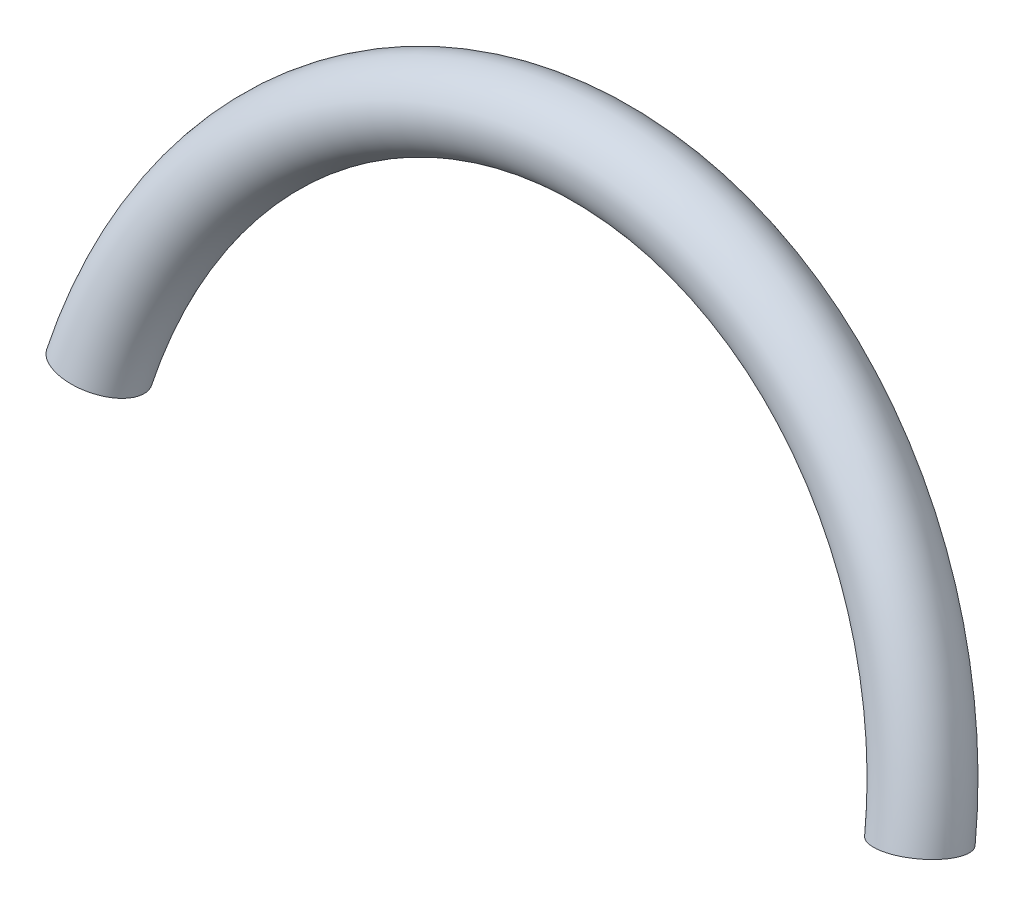
ISO-10303-21;
HEADER;
FILE_DESCRIPTION(('STEP AP214'),'2;1');
FILE_NAME('part.step','',(''),(''),'','','');
FILE_SCHEMA(('AUTOMOTIVE_DESIGN { 1 0 10303 214 1 1 1 1 }'));
ENDSEC;
DATA;
#1=APPLICATION_CONTEXT('core data for automotive mechanical design processes');
#2=APPLICATION_PROTOCOL_DEFINITION('international standard','automotive_design',2000,#1);
#3=PRODUCT_CONTEXT('',#1,'mechanical');
#4=PRODUCT('Part','Part','',(#3));
#5=PRODUCT_RELATED_PRODUCT_CATEGORY('part','',(#4));
#6=PRODUCT_DEFINITION_FORMATION('','',#4);
#7=PRODUCT_DEFINITION_CONTEXT('part definition',#1,'design');
#8=PRODUCT_DEFINITION('design','',#6,#7);
#9=PRODUCT_DEFINITION_SHAPE('','',#8);
#10=(LENGTH_UNIT() NAMED_UNIT(*) SI_UNIT(.MILLI.,.METRE.));
#11=(NAMED_UNIT(*) PLANE_ANGLE_UNIT() SI_UNIT($,.RADIAN.));
#12=(NAMED_UNIT(*) SI_UNIT($,.STERADIAN.) SOLID_ANGLE_UNIT());
#13=UNCERTAINTY_MEASURE_WITH_UNIT(LENGTH_MEASURE(1.E-05),#10,'distance_accuracy_value','');
#14=(GEOMETRIC_REPRESENTATION_CONTEXT(3) GLOBAL_UNCERTAINTY_ASSIGNED_CONTEXT((#13)) GLOBAL_UNIT_ASSIGNED_CONTEXT((#10,
#11,#12)) REPRESENTATION_CONTEXT('',''));
#15=CARTESIAN_POINT('',(0.,0.,0.));
#16=DIRECTION('',(0.,0.,1.));
#17=DIRECTION('',(1.,0.,0.));
#18=AXIS2_PLACEMENT_3D('',#15,#16,#17);
#19=CARTESIAN_POINT('',(0.,904.255410655569,-1942.29450703663));
#20=DIRECTION('',(0.,-0.258819045102518,-0.965925826289069));
#21=DIRECTION('',(0.,0.965925826289069,-0.258819045102518));
#22=AXIS2_PLACEMENT_3D('',#19,#20,#21);
#23=TOROIDAL_SURFACE('',#22,116.149429379517,9.79999999999998);
#24=CARTESIAN_POINT('',(-115.,920.,-1946.51325703663));
#25=DIRECTION('',(-0.140336447675245,-0.956366902675757,0.25625773923976));
#26=DIRECTION('',(0.,-0.258819045102461,-0.965925826289084));
#27=AXIS2_PLACEMENT_3D('',#24,#25,#26);
#28=CIRCLE('',#27,9.79999999999998);
#29=CARTESIAN_POINT('',(-124.703017965913,921.328435071956,-1946.86921014136));
#30=VERTEX_POINT('',#29);
#31=EDGE_CURVE('E49',#30,#30,#28,.T.);
#32=CARTESIAN_POINT('',(115.,920.,-1946.51325703663));
#33=DIRECTION('',(0.140336447675245,-0.956366902675727,0.256257739239872));
#34=DIRECTION('',(0.,-0.258819045102574,-0.965925826289054));
#35=AXIS2_PLACEMENT_3D('',#32,#33,#34);
#36=CIRCLE('',#35,9.79999999999998);
#37=CARTESIAN_POINT('',(124.703017965913,921.328435071956,-1946.86921014136));
#38=VERTEX_POINT('',#37);
#39=EDGE_CURVE('E10',#38,#38,#36,.T.);
#40=CARTESIAN_POINT('',(0.,904.255410655569,-1942.29450703663));
#41=DIRECTION('',(0.,-0.258819045102518,-0.965925826289069));
#42=DIRECTION('',(0.,0.965925826289069,-0.258819045102518));
#43=AXIS2_PLACEMENT_3D('',#40,#41,#42);
#44=CIRCLE('',#43,125.949429379517);
#45=EDGE_CURVE('',#30,#38,#44,.T.);
#46=ORIENTED_EDGE('',*,*,#31,.T.);
#47=ORIENTED_EDGE('',*,*,#39,.T.);
#48=ORIENTED_EDGE('',*,*,#45,.T.);
#49=ORIENTED_EDGE('',*,*,#45,.F.);
#50=EDGE_LOOP('',(#46,#48,#47,#49));
#51=FACE_BOUND('',#50,.T.);
#52=ADVANCED_FACE('F39',(#51),#23,.F.);
#53=CARTESIAN_POINT('',(115.,920.,-1946.51325703663));
#54=DIRECTION('',(0.140336447675245,-0.956366902675727,0.256257739239872));
#55=DIRECTION('',(0.,-0.258819045102574,-0.965925826289054));
#56=AXIS2_PLACEMENT_3D('',#53,#54,#55);
#57=PLANE('',#56);
#58=ORIENTED_EDGE('',*,*,#39,.F.);
#59=EDGE_LOOP('',(#58));
#60=FACE_BOUND('',#59,.T.);
#61=CARTESIAN_POINT('',(115.,920.,-1946.51325703663));
#62=DIRECTION('',(0.140336447675245,-0.956366902675727,0.256257739239872));
#63=DIRECTION('',(0.,-0.258819045102574,-0.965925826289054));
#64=AXIS2_PLACEMENT_3D('',#61,#62,#63);
#65=CIRCLE('',#64,11.);
#66=CARTESIAN_POINT('',(125.891142614801,921.491100590971,-1946.91279623581));
#67=VERTEX_POINT('',#66);
#68=EDGE_CURVE('E45',#67,#67,#65,.F.);
#69=ORIENTED_EDGE('',*,*,#68,.F.);
#70=EDGE_LOOP('',(#69));
#71=FACE_BOUND('',#70,.T.);
#72=ADVANCED_FACE('F69',(#60,#71),#57,.T.);
#73=CARTESIAN_POINT('',(0.,904.255410655569,-1942.29450703663));
#74=DIRECTION('',(0.,-0.258819045102518,-0.965925826289069));
#75=DIRECTION('',(0.,0.965925826289069,-0.258819045102518));
#76=AXIS2_PLACEMENT_3D('',#73,#74,#75);
#77=TOROIDAL_SURFACE('',#76,116.149429379517,11.);
#78=CARTESIAN_POINT('',(-115.,920.,-1946.51325703663));
#79=DIRECTION('',(-0.140336447675245,-0.956366902675757,0.25625773923976));
#80=DIRECTION('',(0.,-0.258819045102461,-0.965925826289084));
#81=AXIS2_PLACEMENT_3D('',#78,#79,#80);
#82=CIRCLE('',#81,11.);
#83=CARTESIAN_POINT('',(-125.891142614801,921.491100590971,-1946.91279623581));
#84=VERTEX_POINT('',#83);
#85=EDGE_CURVE('E53',#84,#84,#82,.F.);
#86=CARTESIAN_POINT('',(0.,904.255410655569,-1942.29450703663));
#87=DIRECTION('',(0.,-0.258819045102518,-0.965925826289069));
#88=DIRECTION('',(0.,0.965925826289069,-0.258819045102518));
#89=AXIS2_PLACEMENT_3D('',#86,#87,#88);
#90=CIRCLE('',#89,127.149429379517);
#91=EDGE_CURVE('',#84,#67,#90,.T.);
#92=ORIENTED_EDGE('',*,*,#85,.T.);
#93=ORIENTED_EDGE('',*,*,#68,.T.);
#94=ORIENTED_EDGE('',*,*,#91,.T.);
#95=ORIENTED_EDGE('',*,*,#91,.F.);
#96=EDGE_LOOP('',(#92,#94,#93,#95));
#97=FACE_BOUND('',#96,.T.);
#98=ADVANCED_FACE('F59',(#97),#77,.T.);
#99=CARTESIAN_POINT('',(-115.,920.,-1946.51325703663));
#100=DIRECTION('',(-0.140336447675245,-0.956366902675757,0.25625773923976));
#101=DIRECTION('',(0.,-0.258819045102461,-0.965925826289084));
#102=AXIS2_PLACEMENT_3D('',#99,#100,#101);
#103=PLANE('',#102);
#104=ORIENTED_EDGE('',*,*,#31,.F.);
#105=EDGE_LOOP('',(#104));
#106=FACE_BOUND('',#105,.T.);
#107=ORIENTED_EDGE('',*,*,#85,.F.);
#108=EDGE_LOOP('',(#107));
#109=FACE_BOUND('',#108,.T.);
#110=ADVANCED_FACE('F61',(#106,#109),#103,.T.);
#111=CLOSED_SHELL('',(#52,#72,#98,#110));
#112=MANIFOLD_SOLID_BREP('B2',#111);
#113=ADVANCED_BREP_SHAPE_REPRESENTATION('',(#18,#112),#14);
#114=SHAPE_DEFINITION_REPRESENTATION(#9,#113);
ENDSEC;
END-ISO-10303-21;
